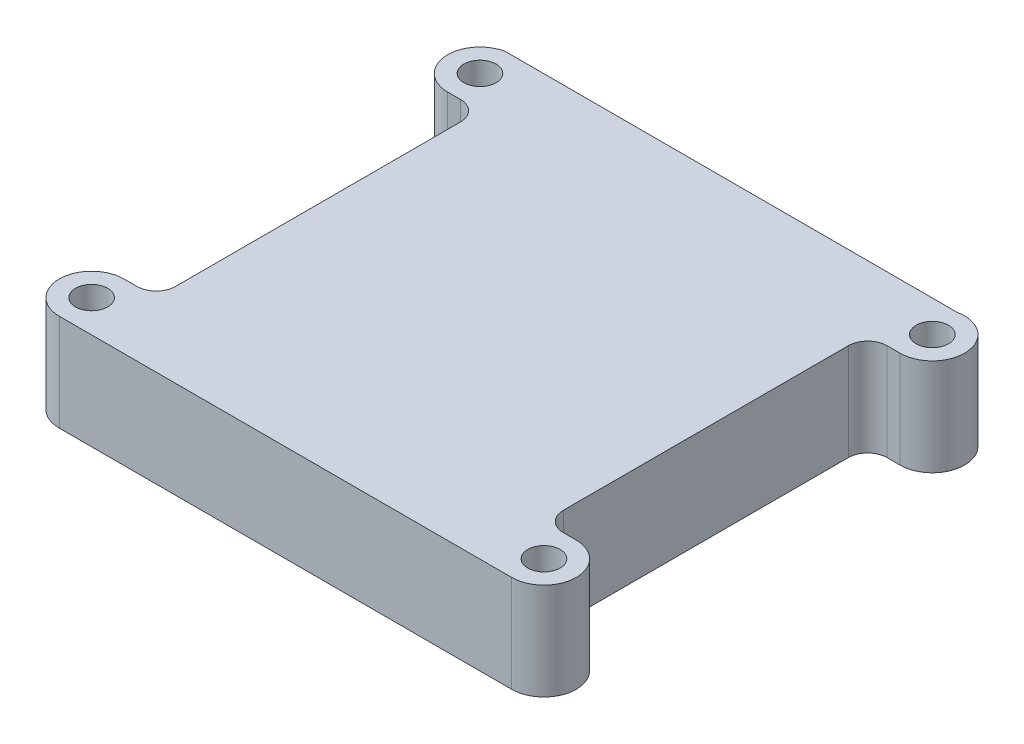
ISO-10303-21;
HEADER;
FILE_DESCRIPTION(('STEP AP214'),'2;1');
FILE_NAME('part.step','',(''),(''),'','','');
FILE_SCHEMA(('AUTOMOTIVE_DESIGN { 1 0 10303 214 1 1 1 1 }'));
ENDSEC;
DATA;
#1=APPLICATION_CONTEXT('core data for automotive mechanical design processes');
#2=APPLICATION_PROTOCOL_DEFINITION('international standard','automotive_design',2000,#1);
#3=PRODUCT_CONTEXT('',#1,'mechanical');
#4=PRODUCT('Part','Part','',(#3));
#5=PRODUCT_RELATED_PRODUCT_CATEGORY('part','',(#4));
#6=PRODUCT_DEFINITION_FORMATION('','',#4);
#7=PRODUCT_DEFINITION_CONTEXT('part definition',#1,'design');
#8=PRODUCT_DEFINITION('design','',#6,#7);
#9=PRODUCT_DEFINITION_SHAPE('','',#8);
#10=(LENGTH_UNIT() NAMED_UNIT(*) SI_UNIT(.MILLI.,.METRE.));
#11=(NAMED_UNIT(*) PLANE_ANGLE_UNIT() SI_UNIT($,.RADIAN.));
#12=(NAMED_UNIT(*) SI_UNIT($,.STERADIAN.) SOLID_ANGLE_UNIT());
#13=UNCERTAINTY_MEASURE_WITH_UNIT(LENGTH_MEASURE(1.E-05),#10,'distance_accuracy_value','');
#14=(GEOMETRIC_REPRESENTATION_CONTEXT(3) GLOBAL_UNCERTAINTY_ASSIGNED_CONTEXT((#13)) GLOBAL_UNIT_ASSIGNED_CONTEXT((#10,
#11,#12)) REPRESENTATION_CONTEXT('',''));
#15=CARTESIAN_POINT('',(0.,0.,0.));
#16=DIRECTION('',(0.,0.,1.));
#17=DIRECTION('',(1.,0.,0.));
#18=AXIS2_PLACEMENT_3D('',#15,#16,#17);
#19=CARTESIAN_POINT('',(35.,15.,-30.0989593233472));
#20=DIRECTION('',(0.,1.,0.));
#21=DIRECTION('',(0.,0.,1.));
#22=AXIS2_PLACEMENT_3D('',#19,#20,#21);
#23=PLANE('',#22);
#24=CARTESIAN_POINT('',(35.,15.,30.));
#25=DIRECTION('',(0.,1.,0.));
#26=DIRECTION('',(0.,0.,1.));
#27=AXIS2_PLACEMENT_3D('',#24,#25,#26);
#28=CIRCLE('',#27,2.5);
#29=CARTESIAN_POINT('',(35.,15.,32.5));
#30=VERTEX_POINT('',#29);
#31=EDGE_CURVE('E526',#30,#30,#28,.T.);
#32=ORIENTED_EDGE('',*,*,#31,.F.);
#33=EDGE_LOOP('',(#32));
#34=FACE_BOUND('',#33,.T.);
#35=CARTESIAN_POINT('',(-35.,15.,-30.0989593233472));
#36=DIRECTION('',(0.,1.,0.));
#37=DIRECTION('',(0.,0.,1.));
#38=AXIS2_PLACEMENT_3D('',#35,#36,#37);
#39=CIRCLE('',#38,2.5);
#40=CARTESIAN_POINT('',(-35.,15.,-27.5989593233472));
#41=VERTEX_POINT('',#40);
#42=EDGE_CURVE('E180',#41,#41,#39,.T.);
#43=ORIENTED_EDGE('',*,*,#42,.F.);
#44=EDGE_LOOP('',(#43));
#45=FACE_BOUND('',#44,.T.);
#46=DIRECTION('',(-1.,0.,0.));
#47=VECTOR('',#46,1.);
#48=CARTESIAN_POINT('',(30.,15.,-35.));
#49=LINE('',#48,#47);
#50=CARTESIAN_POINT('',(34.0101513823847,15.,-35.));
#51=VERTEX_POINT('',#50);
#52=CARTESIAN_POINT('',(-35.9898486176153,15.,-35.));
#53=VERTEX_POINT('',#52);
#54=EDGE_CURVE('E116',#51,#53,#49,.T.);
#55=ORIENTED_EDGE('',*,*,#54,.T.);
#56=CARTESIAN_POINT('',(-35.,15.,-30.0989593233472));
#57=DIRECTION('',(0.,1.,0.));
#58=DIRECTION('',(0.,0.,1.));
#59=AXIS2_PLACEMENT_3D('',#56,#57,#58);
#60=CIRCLE('',#59,5.);
#61=CARTESIAN_POINT('',(-35.,15.,-25.0989593233472));
#62=VERTEX_POINT('',#61);
#63=EDGE_CURVE('E298',#53,#62,#60,.T.);
#64=ORIENTED_EDGE('',*,*,#63,.T.);
#65=DIRECTION('',(1.,0.,0.));
#66=VECTOR('',#65,1.);
#67=CARTESIAN_POINT('',(-35.,15.,-25.0989593233472));
#68=LINE('',#67,#66);
#69=CARTESIAN_POINT('',(-33.,15.,-25.0989593233472));
#70=VERTEX_POINT('',#69);
#71=EDGE_CURVE('E249',#62,#70,#68,.T.);
#72=ORIENTED_EDGE('',*,*,#71,.T.);
#73=CARTESIAN_POINT('',(-33.,15.,-22.0989593233472));
#74=DIRECTION('',(0.,-1.,0.));
#75=DIRECTION('',(0.,0.,-1.));
#76=AXIS2_PLACEMENT_3D('',#73,#74,#75);
#77=CIRCLE('',#76,3.);
#78=CARTESIAN_POINT('',(-30.,15.,-22.0989593233472));
#79=VERTEX_POINT('',#78);
#80=EDGE_CURVE('E268',#70,#79,#77,.T.);
#81=ORIENTED_EDGE('',*,*,#80,.T.);
#82=DIRECTION('',(0.,0.,1.));
#83=VECTOR('',#82,1.);
#84=CARTESIAN_POINT('',(-30.,15.,22.));
#85=LINE('',#84,#83);
#86=CARTESIAN_POINT('',(-30.,15.,22.));
#87=VERTEX_POINT('',#86);
#88=EDGE_CURVE('E265',#79,#87,#85,.T.);
#89=ORIENTED_EDGE('',*,*,#88,.T.);
#90=CARTESIAN_POINT('',(-33.,15.,22.));
#91=DIRECTION('',(0.,-1.,0.));
#92=DIRECTION('',(0.,0.,1.));
#93=AXIS2_PLACEMENT_3D('',#90,#91,#92);
#94=CIRCLE('',#93,3.);
#95=CARTESIAN_POINT('',(-33.,15.,25.));
#96=VERTEX_POINT('',#95);
#97=EDGE_CURVE('E267',#87,#96,#94,.T.);
#98=ORIENTED_EDGE('',*,*,#97,.T.);
#99=DIRECTION('',(-1.,0.,0.));
#100=VECTOR('',#99,1.);
#101=CARTESIAN_POINT('',(-35.,15.,25.));
#102=LINE('',#101,#100);
#103=CARTESIAN_POINT('',(-35.,15.,25.));
#104=VERTEX_POINT('',#103);
#105=EDGE_CURVE('E270',#96,#104,#102,.T.);
#106=ORIENTED_EDGE('',*,*,#105,.T.);
#107=CARTESIAN_POINT('',(-35.,15.,30.));
#108=DIRECTION('',(0.,1.,0.));
#109=DIRECTION('',(0.,0.,1.));
#110=AXIS2_PLACEMENT_3D('',#107,#108,#109);
#111=CIRCLE('',#110,5.);
#112=CARTESIAN_POINT('',(-35.,15.,35.));
#113=VERTEX_POINT('',#112);
#114=EDGE_CURVE('E276',#104,#113,#111,.T.);
#115=ORIENTED_EDGE('',*,*,#114,.T.);
#116=DIRECTION('',(1.,0.,0.));
#117=VECTOR('',#116,1.);
#118=CARTESIAN_POINT('',(-35.,15.,35.));
#119=LINE('',#118,#117);
#120=CARTESIAN_POINT('',(35.,15.,35.));
#121=VERTEX_POINT('',#120);
#122=EDGE_CURVE('E278',#113,#121,#119,.T.);
#123=ORIENTED_EDGE('',*,*,#122,.T.);
#124=CARTESIAN_POINT('',(35.,15.,30.));
#125=DIRECTION('',(0.,1.,0.));
#126=DIRECTION('',(0.,0.,1.));
#127=AXIS2_PLACEMENT_3D('',#124,#125,#126);
#128=CIRCLE('',#127,5.);
#129=CARTESIAN_POINT('',(35.,15.,25.));
#130=VERTEX_POINT('',#129);
#131=EDGE_CURVE('E280',#121,#130,#128,.T.);
#132=ORIENTED_EDGE('',*,*,#131,.T.);
#133=DIRECTION('',(-1.,0.,0.));
#134=VECTOR('',#133,1.);
#135=CARTESIAN_POINT('',(33.,15.,25.));
#136=LINE('',#135,#134);
#137=CARTESIAN_POINT('',(33.,15.,25.));
#138=VERTEX_POINT('',#137);
#139=EDGE_CURVE('E282',#130,#138,#136,.T.);
#140=ORIENTED_EDGE('',*,*,#139,.T.);
#141=CARTESIAN_POINT('',(33.,15.,22.));
#142=DIRECTION('',(0.,-1.,0.));
#143=DIRECTION('',(0.,0.,-1.));
#144=AXIS2_PLACEMENT_3D('',#141,#142,#143);
#145=CIRCLE('',#144,3.);
#146=CARTESIAN_POINT('',(30.,15.,22.));
#147=VERTEX_POINT('',#146);
#148=EDGE_CURVE('E284',#138,#147,#145,.T.);
#149=ORIENTED_EDGE('',*,*,#148,.T.);
#150=DIRECTION('',(0.,0.,-1.));
#151=VECTOR('',#150,1.);
#152=CARTESIAN_POINT('',(30.,15.,22.));
#153=LINE('',#152,#151);
#154=CARTESIAN_POINT('',(30.,15.,-22.0989593233472));
#155=VERTEX_POINT('',#154);
#156=EDGE_CURVE('E160',#147,#155,#153,.T.);
#157=ORIENTED_EDGE('',*,*,#156,.T.);
#158=CARTESIAN_POINT('',(33.,15.,-22.0989593233472));
#159=DIRECTION('',(0.,-1.,0.));
#160=DIRECTION('',(0.,0.,1.));
#161=AXIS2_PLACEMENT_3D('',#158,#159,#160);
#162=CIRCLE('',#161,3.);
#163=CARTESIAN_POINT('',(33.,15.,-25.0989593233472));
#164=VERTEX_POINT('',#163);
#165=EDGE_CURVE('E154',#155,#164,#162,.T.);
#166=ORIENTED_EDGE('',*,*,#165,.T.);
#167=DIRECTION('',(1.,0.,0.));
#168=VECTOR('',#167,1.);
#169=CARTESIAN_POINT('',(33.,15.,-25.0989593233472));
#170=LINE('',#169,#168);
#171=CARTESIAN_POINT('',(35.,15.,-25.0989593233472));
#172=VERTEX_POINT('',#171);
#173=EDGE_CURVE('E158',#164,#172,#170,.T.);
#174=ORIENTED_EDGE('',*,*,#173,.T.);
#175=CARTESIAN_POINT('',(35.,15.,-30.0989593233472));
#176=DIRECTION('',(0.,1.,0.));
#177=DIRECTION('',(0.,0.,1.));
#178=AXIS2_PLACEMENT_3D('',#175,#176,#177);
#179=CIRCLE('',#178,5.);
#180=EDGE_CURVE('E50',#172,#51,#179,.T.);
#181=ORIENTED_EDGE('',*,*,#180,.T.);
#182=EDGE_LOOP('',(#55,#64,#72,#81,#89,#98,#106,#115,#123,#132,#140,#149,#157,#166,#174,#181));
#183=FACE_BOUND('',#182,.T.);
#184=CARTESIAN_POINT('',(35.,15.,-30.0989593233472));
#185=DIRECTION('',(0.,1.,0.));
#186=DIRECTION('',(0.,0.,1.));
#187=AXIS2_PLACEMENT_3D('',#184,#185,#186);
#188=CIRCLE('',#187,2.5);
#189=CARTESIAN_POINT('',(35.,15.,-27.5989593233472));
#190=VERTEX_POINT('',#189);
#191=EDGE_CURVE('E532',#190,#190,#188,.T.);
#192=ORIENTED_EDGE('',*,*,#191,.F.);
#193=EDGE_LOOP('',(#192));
#194=FACE_BOUND('',#193,.T.);
#195=CARTESIAN_POINT('',(-35.,15.,30.));
#196=DIRECTION('',(0.,1.,0.));
#197=DIRECTION('',(0.,0.,1.));
#198=AXIS2_PLACEMENT_3D('',#195,#196,#197);
#199=CIRCLE('',#198,2.5);
#200=CARTESIAN_POINT('',(-35.,15.,32.5));
#201=VERTEX_POINT('',#200);
#202=EDGE_CURVE('E517',#201,#201,#199,.T.);
#203=ORIENTED_EDGE('',*,*,#202,.F.);
#204=EDGE_LOOP('',(#203));
#205=FACE_BOUND('',#204,.T.);
#206=ADVANCED_FACE('F33',(#34,#45,#183,#194,#205),#23,.T.);
#207=CARTESIAN_POINT('',(35.,0.,-30.0989593233472));
#208=DIRECTION('',(0.,1.,0.));
#209=DIRECTION('',(0.,0.,1.));
#210=AXIS2_PLACEMENT_3D('',#207,#208,#209);
#211=PLANE('',#210);
#212=DIRECTION('',(-1.,0.,0.));
#213=VECTOR('',#212,1.);
#214=CARTESIAN_POINT('',(-35.9898486176153,0.,-35.));
#215=LINE('',#214,#213);
#216=CARTESIAN_POINT('',(34.0101513823847,0.,-35.));
#217=VERTEX_POINT('',#216);
#218=CARTESIAN_POINT('',(-35.9898486176153,0.,-35.));
#219=VERTEX_POINT('',#218);
#220=EDGE_CURVE('E110',#217,#219,#215,.T.);
#221=ORIENTED_EDGE('',*,*,#220,.F.);
#222=CARTESIAN_POINT('',(35.,0.,-30.0989593233472));
#223=DIRECTION('',(0.,1.,0.));
#224=DIRECTION('',(0.,0.,1.));
#225=AXIS2_PLACEMENT_3D('',#222,#223,#224);
#226=CIRCLE('',#225,5.);
#227=CARTESIAN_POINT('',(35.,0.,-25.0989593233472));
#228=VERTEX_POINT('',#227);
#229=EDGE_CURVE('E207',#228,#217,#226,.T.);
#230=ORIENTED_EDGE('',*,*,#229,.F.);
#231=DIRECTION('',(1.,0.,0.));
#232=VECTOR('',#231,1.);
#233=CARTESIAN_POINT('',(33.,0.,-25.0989593233472));
#234=LINE('',#233,#232);
#235=CARTESIAN_POINT('',(33.,0.,-25.0989593233472));
#236=VERTEX_POINT('',#235);
#237=EDGE_CURVE('E103',#236,#228,#234,.T.);
#238=ORIENTED_EDGE('',*,*,#237,.F.);
#239=CARTESIAN_POINT('',(33.,0.,-22.0989593233472));
#240=DIRECTION('',(0.,-1.,0.));
#241=DIRECTION('',(0.,0.,1.));
#242=AXIS2_PLACEMENT_3D('',#239,#240,#241);
#243=CIRCLE('',#242,3.);
#244=CARTESIAN_POINT('',(30.,0.,-22.0989593233472));
#245=VERTEX_POINT('',#244);
#246=EDGE_CURVE('E168',#245,#236,#243,.T.);
#247=ORIENTED_EDGE('',*,*,#246,.F.);
#248=DIRECTION('',(0.,0.,-1.));
#249=VECTOR('',#248,1.);
#250=CARTESIAN_POINT('',(30.,0.,22.));
#251=LINE('',#250,#249);
#252=CARTESIAN_POINT('',(30.,0.,22.));
#253=VERTEX_POINT('',#252);
#254=EDGE_CURVE('E203',#253,#245,#251,.T.);
#255=ORIENTED_EDGE('',*,*,#254,.F.);
#256=CARTESIAN_POINT('',(33.,0.,22.));
#257=DIRECTION('',(0.,-1.,0.));
#258=DIRECTION('',(0.,0.,-1.));
#259=AXIS2_PLACEMENT_3D('',#256,#257,#258);
#260=CIRCLE('',#259,3.);
#261=CARTESIAN_POINT('',(33.,0.,25.));
#262=VERTEX_POINT('',#261);
#263=EDGE_CURVE('E201',#262,#253,#260,.T.);
#264=ORIENTED_EDGE('',*,*,#263,.F.);
#265=DIRECTION('',(-1.,0.,0.));
#266=VECTOR('',#265,1.);
#267=CARTESIAN_POINT('',(33.,0.,25.));
#268=LINE('',#267,#266);
#269=CARTESIAN_POINT('',(35.,0.,25.));
#270=VERTEX_POINT('',#269);
#271=EDGE_CURVE('E199',#270,#262,#268,.T.);
#272=ORIENTED_EDGE('',*,*,#271,.F.);
#273=CARTESIAN_POINT('',(35.,0.,30.));
#274=DIRECTION('',(0.,1.,0.));
#275=DIRECTION('',(0.,0.,1.));
#276=AXIS2_PLACEMENT_3D('',#273,#274,#275);
#277=CIRCLE('',#276,5.);
#278=CARTESIAN_POINT('',(35.,0.,35.));
#279=VERTEX_POINT('',#278);
#280=EDGE_CURVE('E197',#279,#270,#277,.T.);
#281=ORIENTED_EDGE('',*,*,#280,.F.);
#282=DIRECTION('',(1.,0.,0.));
#283=VECTOR('',#282,1.);
#284=CARTESIAN_POINT('',(30.,0.,35.));
#285=LINE('',#284,#283);
#286=CARTESIAN_POINT('',(-35.,0.,35.));
#287=VERTEX_POINT('',#286);
#288=EDGE_CURVE('E195',#287,#279,#285,.T.);
#289=ORIENTED_EDGE('',*,*,#288,.F.);
#290=CARTESIAN_POINT('',(-35.,0.,30.));
#291=DIRECTION('',(0.,1.,0.));
#292=DIRECTION('',(0.,0.,1.));
#293=AXIS2_PLACEMENT_3D('',#290,#291,#292);
#294=CIRCLE('',#293,5.);
#295=CARTESIAN_POINT('',(-35.,0.,25.));
#296=VERTEX_POINT('',#295);
#297=EDGE_CURVE('E192',#296,#287,#294,.T.);
#298=ORIENTED_EDGE('',*,*,#297,.F.);
#299=DIRECTION('',(-1.,0.,0.));
#300=VECTOR('',#299,1.);
#301=CARTESIAN_POINT('',(-35.,0.,25.));
#302=LINE('',#301,#300);
#303=CARTESIAN_POINT('',(-33.,0.,25.));
#304=VERTEX_POINT('',#303);
#305=EDGE_CURVE('E190',#304,#296,#302,.T.);
#306=ORIENTED_EDGE('',*,*,#305,.F.);
#307=CARTESIAN_POINT('',(-33.,0.,22.));
#308=DIRECTION('',(0.,-1.,0.));
#309=DIRECTION('',(0.,0.,1.));
#310=AXIS2_PLACEMENT_3D('',#307,#308,#309);
#311=CIRCLE('',#310,3.);
#312=CARTESIAN_POINT('',(-30.,0.,22.));
#313=VERTEX_POINT('',#312);
#314=EDGE_CURVE('E188',#313,#304,#311,.T.);
#315=ORIENTED_EDGE('',*,*,#314,.F.);
#316=DIRECTION('',(0.,0.,1.));
#317=VECTOR('',#316,1.);
#318=CARTESIAN_POINT('',(-30.,0.,22.));
#319=LINE('',#318,#317);
#320=CARTESIAN_POINT('',(-30.,0.,-22.0989593233472));
#321=VERTEX_POINT('',#320);
#322=EDGE_CURVE('E186',#321,#313,#319,.T.);
#323=ORIENTED_EDGE('',*,*,#322,.F.);
#324=CARTESIAN_POINT('',(-33.,0.,-22.0989593233472));
#325=DIRECTION('',(0.,-1.,0.));
#326=DIRECTION('',(0.,0.,-1.));
#327=AXIS2_PLACEMENT_3D('',#324,#325,#326);
#328=CIRCLE('',#327,3.);
#329=CARTESIAN_POINT('',(-33.,0.,-25.0989593233472));
#330=VERTEX_POINT('',#329);
#331=EDGE_CURVE('E184',#330,#321,#328,.T.);
#332=ORIENTED_EDGE('',*,*,#331,.F.);
#333=DIRECTION('',(1.,0.,0.));
#334=VECTOR('',#333,1.);
#335=CARTESIAN_POINT('',(-35.,0.,-25.0989593233472));
#336=LINE('',#335,#334);
#337=CARTESIAN_POINT('',(-35.,0.,-25.0989593233472));
#338=VERTEX_POINT('',#337);
#339=EDGE_CURVE('E182',#338,#330,#336,.T.);
#340=ORIENTED_EDGE('',*,*,#339,.F.);
#341=CARTESIAN_POINT('',(-35.,0.,-30.0989593233472));
#342=DIRECTION('',(0.,1.,0.));
#343=DIRECTION('',(0.,0.,1.));
#344=AXIS2_PLACEMENT_3D('',#341,#342,#343);
#345=CIRCLE('',#344,5.);
#346=EDGE_CURVE('E179',#219,#338,#345,.T.);
#347=ORIENTED_EDGE('',*,*,#346,.F.);
#348=EDGE_LOOP('',(#221,#230,#238,#247,#255,#264,#272,#281,#289,#298,#306,#315,#323,#332,#340,#347));
#349=FACE_BOUND('',#348,.T.);
#350=CARTESIAN_POINT('',(-35.,0.,-30.0989593233472));
#351=DIRECTION('',(0.,1.,0.));
#352=DIRECTION('',(0.,0.,1.));
#353=AXIS2_PLACEMENT_3D('',#350,#351,#352);
#354=CIRCLE('',#353,2.5);
#355=CARTESIAN_POINT('',(-35.,0.,-27.5989593233472));
#356=VERTEX_POINT('',#355);
#357=EDGE_CURVE('E302',#356,#356,#354,.T.);
#358=ORIENTED_EDGE('',*,*,#357,.T.);
#359=EDGE_LOOP('',(#358));
#360=FACE_BOUND('',#359,.T.);
#361=CARTESIAN_POINT('',(35.,0.,-30.0989593233472));
#362=DIRECTION('',(0.,1.,0.));
#363=DIRECTION('',(0.,0.,1.));
#364=AXIS2_PLACEMENT_3D('',#361,#362,#363);
#365=CIRCLE('',#364,2.5);
#366=CARTESIAN_POINT('',(35.,0.,-27.5989593233472));
#367=VERTEX_POINT('',#366);
#368=EDGE_CURVE('E529',#367,#367,#365,.T.);
#369=ORIENTED_EDGE('',*,*,#368,.T.);
#370=EDGE_LOOP('',(#369));
#371=FACE_BOUND('',#370,.T.);
#372=CARTESIAN_POINT('',(35.,0.,30.));
#373=DIRECTION('',(0.,1.,0.));
#374=DIRECTION('',(0.,0.,1.));
#375=AXIS2_PLACEMENT_3D('',#372,#373,#374);
#376=CIRCLE('',#375,2.5);
#377=CARTESIAN_POINT('',(35.,0.,32.5));
#378=VERTEX_POINT('',#377);
#379=EDGE_CURVE('E523',#378,#378,#376,.T.);
#380=ORIENTED_EDGE('',*,*,#379,.T.);
#381=EDGE_LOOP('',(#380));
#382=FACE_BOUND('',#381,.T.);
#383=CARTESIAN_POINT('',(-35.,0.,30.));
#384=DIRECTION('',(0.,1.,0.));
#385=DIRECTION('',(0.,0.,1.));
#386=AXIS2_PLACEMENT_3D('',#383,#384,#385);
#387=CIRCLE('',#386,2.5);
#388=CARTESIAN_POINT('',(-35.,0.,32.5));
#389=VERTEX_POINT('',#388);
#390=EDGE_CURVE('E520',#389,#389,#387,.T.);
#391=ORIENTED_EDGE('',*,*,#390,.T.);
#392=EDGE_LOOP('',(#391));
#393=FACE_BOUND('',#392,.T.);
#394=ADVANCED_FACE('F253',(#349,#360,#371,#382,#393),#211,.F.);
#395=CARTESIAN_POINT('',(-35.9898486176153,15.,-35.));
#396=DIRECTION('',(0.,0.,1.));
#397=DIRECTION('',(1.,0.,0.));
#398=AXIS2_PLACEMENT_3D('',#395,#396,#397);
#399=PLANE('',#398);
#400=ORIENTED_EDGE('',*,*,#220,.T.);
#401=DIRECTION('',(0.,-1.,0.));
#402=VECTOR('',#401,1.);
#403=CARTESIAN_POINT('',(-35.9898486176153,15.,-35.));
#404=LINE('',#403,#402);
#405=EDGE_CURVE('E11',#53,#219,#404,.T.);
#406=ORIENTED_EDGE('',*,*,#405,.F.);
#407=ORIENTED_EDGE('',*,*,#54,.F.);
#408=DIRECTION('',(0.,-1.,0.));
#409=VECTOR('',#408,1.);
#410=CARTESIAN_POINT('',(34.0101513823847,15.,-35.));
#411=LINE('',#410,#409);
#412=EDGE_CURVE('E174',#51,#217,#411,.T.);
#413=ORIENTED_EDGE('',*,*,#412,.T.);
#414=EDGE_LOOP('',(#400,#406,#407,#413));
#415=FACE_BOUND('',#414,.T.);
#416=ADVANCED_FACE('F35',(#415),#399,.F.);
#417=CARTESIAN_POINT('',(-35.,15.,-30.0989593233472));
#418=DIRECTION('',(0.,-1.,0.));
#419=DIRECTION('',(0.,0.,-1.));
#420=AXIS2_PLACEMENT_3D('',#417,#418,#419);
#421=CYLINDRICAL_SURFACE('',#420,5.);
#422=ORIENTED_EDGE('',*,*,#346,.T.);
#423=DIRECTION('',(0.,-1.,0.));
#424=VECTOR('',#423,1.);
#425=CARTESIAN_POINT('',(-35.,15.,-25.0989593233472));
#426=LINE('',#425,#424);
#427=EDGE_CURVE('E42',#62,#338,#426,.T.);
#428=ORIENTED_EDGE('',*,*,#427,.F.);
#429=ORIENTED_EDGE('',*,*,#63,.F.);
#430=ORIENTED_EDGE('',*,*,#405,.T.);
#431=EDGE_LOOP('',(#422,#428,#429,#430));
#432=FACE_BOUND('',#431,.T.);
#433=ADVANCED_FACE('F304',(#432),#421,.T.);
#434=CARTESIAN_POINT('',(-35.,15.,-25.0989593233472));
#435=DIRECTION('',(0.,0.,-1.));
#436=DIRECTION('',(-1.,0.,0.));
#437=AXIS2_PLACEMENT_3D('',#434,#435,#436);
#438=PLANE('',#437);
#439=ORIENTED_EDGE('',*,*,#339,.T.);
#440=DIRECTION('',(0.,-1.,0.));
#441=VECTOR('',#440,1.);
#442=CARTESIAN_POINT('',(-33.,15.,-25.0989593233472));
#443=LINE('',#442,#441);
#444=EDGE_CURVE('E240',#70,#330,#443,.T.);
#445=ORIENTED_EDGE('',*,*,#444,.F.);
#446=ORIENTED_EDGE('',*,*,#71,.F.);
#447=ORIENTED_EDGE('',*,*,#427,.T.);
#448=EDGE_LOOP('',(#439,#445,#446,#447));
#449=FACE_BOUND('',#448,.T.);
#450=ADVANCED_FACE('F247',(#449),#438,.F.);
#451=CARTESIAN_POINT('',(-33.,15.,-22.0989593233472));
#452=DIRECTION('',(0.,-1.,0.));
#453=DIRECTION('',(0.,0.,-1.));
#454=AXIS2_PLACEMENT_3D('',#451,#452,#453);
#455=CYLINDRICAL_SURFACE('',#454,3.);
#456=ORIENTED_EDGE('',*,*,#331,.T.);
#457=DIRECTION('',(0.,-1.,0.));
#458=VECTOR('',#457,1.);
#459=CARTESIAN_POINT('',(-30.,15.,-22.0989593233472));
#460=LINE('',#459,#458);
#461=EDGE_CURVE('E237',#79,#321,#460,.T.);
#462=ORIENTED_EDGE('',*,*,#461,.F.);
#463=ORIENTED_EDGE('',*,*,#80,.F.);
#464=ORIENTED_EDGE('',*,*,#444,.T.);
#465=EDGE_LOOP('',(#456,#462,#463,#464));
#466=FACE_BOUND('',#465,.T.);
#467=ADVANCED_FACE('F259',(#466),#455,.F.);
#468=CARTESIAN_POINT('',(-30.,15.,22.));
#469=DIRECTION('',(1.,0.,0.));
#470=DIRECTION('',(0.,0.,-1.));
#471=AXIS2_PLACEMENT_3D('',#468,#469,#470);
#472=PLANE('',#471);
#473=ORIENTED_EDGE('',*,*,#322,.T.);
#474=DIRECTION('',(0.,-1.,0.));
#475=VECTOR('',#474,1.);
#476=CARTESIAN_POINT('',(-30.,15.,22.));
#477=LINE('',#476,#475);
#478=EDGE_CURVE('E234',#87,#313,#477,.T.);
#479=ORIENTED_EDGE('',*,*,#478,.F.);
#480=ORIENTED_EDGE('',*,*,#88,.F.);
#481=ORIENTED_EDGE('',*,*,#461,.T.);
#482=EDGE_LOOP('',(#473,#479,#480,#481));
#483=FACE_BOUND('',#482,.T.);
#484=ADVANCED_FACE('F263',(#483),#472,.F.);
#485=CARTESIAN_POINT('',(-33.,15.,22.));
#486=DIRECTION('',(0.,-1.,0.));
#487=DIRECTION('',(0.,0.,-1.));
#488=AXIS2_PLACEMENT_3D('',#485,#486,#487);
#489=CYLINDRICAL_SURFACE('',#488,3.);
#490=ORIENTED_EDGE('',*,*,#314,.T.);
#491=DIRECTION('',(0.,-1.,0.));
#492=VECTOR('',#491,1.);
#493=CARTESIAN_POINT('',(-33.,15.,25.));
#494=LINE('',#493,#492);
#495=EDGE_CURVE('E231',#96,#304,#494,.T.);
#496=ORIENTED_EDGE('',*,*,#495,.F.);
#497=ORIENTED_EDGE('',*,*,#97,.F.);
#498=ORIENTED_EDGE('',*,*,#478,.T.);
#499=EDGE_LOOP('',(#490,#496,#497,#498));
#500=FACE_BOUND('',#499,.T.);
#501=ADVANCED_FACE('F353',(#500),#489,.F.);
#502=CARTESIAN_POINT('',(-35.,15.,25.));
#503=DIRECTION('',(0.,0.,1.));
#504=DIRECTION('',(1.,0.,0.));
#505=AXIS2_PLACEMENT_3D('',#502,#503,#504);
#506=PLANE('',#505);
#507=ORIENTED_EDGE('',*,*,#305,.T.);
#508=DIRECTION('',(0.,-1.,0.));
#509=VECTOR('',#508,1.);
#510=CARTESIAN_POINT('',(-35.,15.,25.));
#511=LINE('',#510,#509);
#512=EDGE_CURVE('E228',#104,#296,#511,.T.);
#513=ORIENTED_EDGE('',*,*,#512,.F.);
#514=ORIENTED_EDGE('',*,*,#105,.F.);
#515=ORIENTED_EDGE('',*,*,#495,.T.);
#516=EDGE_LOOP('',(#507,#513,#514,#515));
#517=FACE_BOUND('',#516,.T.);
#518=ADVANCED_FACE('F349',(#517),#506,.F.);
#519=CARTESIAN_POINT('',(-35.,15.,30.));
#520=DIRECTION('',(0.,-1.,0.));
#521=DIRECTION('',(0.,0.,-1.));
#522=AXIS2_PLACEMENT_3D('',#519,#520,#521);
#523=CYLINDRICAL_SURFACE('',#522,5.);
#524=ORIENTED_EDGE('',*,*,#297,.T.);
#525=DIRECTION('',(0.,-1.,0.));
#526=VECTOR('',#525,1.);
#527=CARTESIAN_POINT('',(-35.,15.,35.));
#528=LINE('',#527,#526);
#529=EDGE_CURVE('E225',#113,#287,#528,.T.);
#530=ORIENTED_EDGE('',*,*,#529,.F.);
#531=ORIENTED_EDGE('',*,*,#114,.F.);
#532=ORIENTED_EDGE('',*,*,#512,.T.);
#533=EDGE_LOOP('',(#524,#530,#531,#532));
#534=FACE_BOUND('',#533,.T.);
#535=ADVANCED_FACE('F345',(#534),#523,.T.);
#536=CARTESIAN_POINT('',(30.,15.,35.));
#537=DIRECTION('',(0.,0.,-1.));
#538=DIRECTION('',(-1.,0.,0.));
#539=AXIS2_PLACEMENT_3D('',#536,#537,#538);
#540=PLANE('',#539);
#541=ORIENTED_EDGE('',*,*,#288,.T.);
#542=DIRECTION('',(0.,-1.,0.));
#543=VECTOR('',#542,1.);
#544=CARTESIAN_POINT('',(35.,15.,35.));
#545=LINE('',#544,#543);
#546=EDGE_CURVE('E222',#121,#279,#545,.T.);
#547=ORIENTED_EDGE('',*,*,#546,.F.);
#548=ORIENTED_EDGE('',*,*,#122,.F.);
#549=ORIENTED_EDGE('',*,*,#529,.T.);
#550=EDGE_LOOP('',(#541,#547,#548,#549));
#551=FACE_BOUND('',#550,.T.);
#552=ADVANCED_FACE('F341',(#551),#540,.F.);
#553=CARTESIAN_POINT('',(35.,15.,30.));
#554=DIRECTION('',(0.,-1.,0.));
#555=DIRECTION('',(0.,0.,-1.));
#556=AXIS2_PLACEMENT_3D('',#553,#554,#555);
#557=CYLINDRICAL_SURFACE('',#556,5.);
#558=ORIENTED_EDGE('',*,*,#280,.T.);
#559=DIRECTION('',(0.,-1.,0.));
#560=VECTOR('',#559,1.);
#561=CARTESIAN_POINT('',(35.,15.,25.));
#562=LINE('',#561,#560);
#563=EDGE_CURVE('E219',#130,#270,#562,.T.);
#564=ORIENTED_EDGE('',*,*,#563,.F.);
#565=ORIENTED_EDGE('',*,*,#131,.F.);
#566=ORIENTED_EDGE('',*,*,#546,.T.);
#567=EDGE_LOOP('',(#558,#564,#565,#566));
#568=FACE_BOUND('',#567,.T.);
#569=ADVANCED_FACE('F337',(#568),#557,.T.);
#570=CARTESIAN_POINT('',(33.,15.,25.));
#571=DIRECTION('',(0.,0.,1.));
#572=DIRECTION('',(1.,0.,0.));
#573=AXIS2_PLACEMENT_3D('',#570,#571,#572);
#574=PLANE('',#573);
#575=ORIENTED_EDGE('',*,*,#271,.T.);
#576=DIRECTION('',(0.,-1.,0.));
#577=VECTOR('',#576,1.);
#578=CARTESIAN_POINT('',(33.,15.,25.));
#579=LINE('',#578,#577);
#580=EDGE_CURVE('E216',#138,#262,#579,.T.);
#581=ORIENTED_EDGE('',*,*,#580,.F.);
#582=ORIENTED_EDGE('',*,*,#139,.F.);
#583=ORIENTED_EDGE('',*,*,#563,.T.);
#584=EDGE_LOOP('',(#575,#581,#582,#583));
#585=FACE_BOUND('',#584,.T.);
#586=ADVANCED_FACE('F334',(#585),#574,.F.);
#587=CARTESIAN_POINT('',(33.,15.,22.));
#588=DIRECTION('',(0.,-1.,0.));
#589=DIRECTION('',(0.,0.,-1.));
#590=AXIS2_PLACEMENT_3D('',#587,#588,#589);
#591=CYLINDRICAL_SURFACE('',#590,3.);
#592=ORIENTED_EDGE('',*,*,#263,.T.);
#593=DIRECTION('',(0.,-1.,0.));
#594=VECTOR('',#593,1.);
#595=CARTESIAN_POINT('',(30.,15.,22.));
#596=LINE('',#595,#594);
#597=EDGE_CURVE('E213',#147,#253,#596,.T.);
#598=ORIENTED_EDGE('',*,*,#597,.F.);
#599=ORIENTED_EDGE('',*,*,#148,.F.);
#600=ORIENTED_EDGE('',*,*,#580,.T.);
#601=EDGE_LOOP('',(#592,#598,#599,#600));
#602=FACE_BOUND('',#601,.T.);
#603=ADVANCED_FACE('F290',(#602),#591,.F.);
#604=CARTESIAN_POINT('',(30.,15.,22.));
#605=DIRECTION('',(-1.,0.,0.));
#606=DIRECTION('',(0.,0.,1.));
#607=AXIS2_PLACEMENT_3D('',#604,#605,#606);
#608=PLANE('',#607);
#609=ORIENTED_EDGE('',*,*,#254,.T.);
#610=DIRECTION('',(0.,-1.,0.));
#611=VECTOR('',#610,1.);
#612=CARTESIAN_POINT('',(30.,15.,-22.0989593233472));
#613=LINE('',#612,#611);
#614=EDGE_CURVE('E169',#155,#245,#613,.T.);
#615=ORIENTED_EDGE('',*,*,#614,.F.);
#616=ORIENTED_EDGE('',*,*,#156,.F.);
#617=ORIENTED_EDGE('',*,*,#597,.T.);
#618=EDGE_LOOP('',(#609,#615,#616,#617));
#619=FACE_BOUND('',#618,.T.);
#620=ADVANCED_FACE('F294',(#619),#608,.F.);
#621=CARTESIAN_POINT('',(33.,15.,-22.0989593233472));
#622=DIRECTION('',(0.,-1.,0.));
#623=DIRECTION('',(0.,0.,-1.));
#624=AXIS2_PLACEMENT_3D('',#621,#622,#623);
#625=CYLINDRICAL_SURFACE('',#624,3.);
#626=ORIENTED_EDGE('',*,*,#246,.T.);
#627=DIRECTION('',(0.,-1.,0.));
#628=VECTOR('',#627,1.);
#629=CARTESIAN_POINT('',(33.,15.,-25.0989593233472));
#630=LINE('',#629,#628);
#631=EDGE_CURVE('E165',#164,#236,#630,.T.);
#632=ORIENTED_EDGE('',*,*,#631,.F.);
#633=ORIENTED_EDGE('',*,*,#165,.F.);
#634=ORIENTED_EDGE('',*,*,#614,.T.);
#635=EDGE_LOOP('',(#626,#632,#633,#634));
#636=FACE_BOUND('',#635,.T.);
#637=ADVANCED_FACE('F166',(#636),#625,.F.);
#638=CARTESIAN_POINT('',(33.,15.,-25.0989593233472));
#639=DIRECTION('',(0.,0.,-1.));
#640=DIRECTION('',(-1.,0.,0.));
#641=AXIS2_PLACEMENT_3D('',#638,#639,#640);
#642=PLANE('',#641);
#643=ORIENTED_EDGE('',*,*,#237,.T.);
#644=DIRECTION('',(0.,-1.,0.));
#645=VECTOR('',#644,1.);
#646=CARTESIAN_POINT('',(35.,15.,-25.0989593233472));
#647=LINE('',#646,#645);
#648=EDGE_CURVE('E170',#172,#228,#647,.T.);
#649=ORIENTED_EDGE('',*,*,#648,.F.);
#650=ORIENTED_EDGE('',*,*,#173,.F.);
#651=ORIENTED_EDGE('',*,*,#631,.T.);
#652=EDGE_LOOP('',(#643,#649,#650,#651));
#653=FACE_BOUND('',#652,.T.);
#654=ADVANCED_FACE('F172',(#653),#642,.F.);
#655=CARTESIAN_POINT('',(35.,15.,-30.0989593233472));
#656=DIRECTION('',(0.,-1.,0.));
#657=DIRECTION('',(0.,0.,-1.));
#658=AXIS2_PLACEMENT_3D('',#655,#656,#657);
#659=CYLINDRICAL_SURFACE('',#658,5.);
#660=ORIENTED_EDGE('',*,*,#229,.T.);
#661=ORIENTED_EDGE('',*,*,#412,.F.);
#662=ORIENTED_EDGE('',*,*,#180,.F.);
#663=ORIENTED_EDGE('',*,*,#648,.T.);
#664=EDGE_LOOP('',(#660,#661,#662,#663));
#665=FACE_BOUND('',#664,.T.);
#666=ADVANCED_FACE('F296',(#665),#659,.T.);
#667=CARTESIAN_POINT('',(-35.,15.,-30.0989593233472));
#668=DIRECTION('',(0.,-1.,0.));
#669=DIRECTION('',(0.,0.,-1.));
#670=AXIS2_PLACEMENT_3D('',#667,#668,#669);
#671=CYLINDRICAL_SURFACE('',#670,2.5);
#672=ORIENTED_EDGE('',*,*,#42,.T.);
#673=EDGE_LOOP('',(#672));
#674=FACE_BOUND('',#673,.T.);
#675=ORIENTED_EDGE('',*,*,#357,.F.);
#676=EDGE_LOOP('',(#675));
#677=FACE_BOUND('',#676,.T.);
#678=ADVANCED_FACE('F321',(#674,#677),#671,.F.);
#679=CARTESIAN_POINT('',(35.,15.,-30.0989593233472));
#680=DIRECTION('',(0.,-1.,0.));
#681=DIRECTION('',(0.,0.,-1.));
#682=AXIS2_PLACEMENT_3D('',#679,#680,#681);
#683=CYLINDRICAL_SURFACE('',#682,2.5);
#684=ORIENTED_EDGE('',*,*,#191,.T.);
#685=EDGE_LOOP('',(#684));
#686=FACE_BOUND('',#685,.T.);
#687=ORIENTED_EDGE('',*,*,#368,.F.);
#688=EDGE_LOOP('',(#687));
#689=FACE_BOUND('',#688,.T.);
#690=ADVANCED_FACE('F419',(#686,#689),#683,.F.);
#691=CARTESIAN_POINT('',(35.,15.,30.));
#692=DIRECTION('',(0.,-1.,0.));
#693=DIRECTION('',(0.,0.,-1.));
#694=AXIS2_PLACEMENT_3D('',#691,#692,#693);
#695=CYLINDRICAL_SURFACE('',#694,2.5);
#696=ORIENTED_EDGE('',*,*,#31,.T.);
#697=EDGE_LOOP('',(#696));
#698=FACE_BOUND('',#697,.T.);
#699=ORIENTED_EDGE('',*,*,#379,.F.);
#700=EDGE_LOOP('',(#699));
#701=FACE_BOUND('',#700,.T.);
#702=ADVANCED_FACE('F426',(#698,#701),#695,.F.);
#703=CARTESIAN_POINT('',(-35.,15.,30.));
#704=DIRECTION('',(0.,-1.,0.));
#705=DIRECTION('',(0.,0.,-1.));
#706=AXIS2_PLACEMENT_3D('',#703,#704,#705);
#707=CYLINDRICAL_SURFACE('',#706,2.5);
#708=ORIENTED_EDGE('',*,*,#202,.T.);
#709=EDGE_LOOP('',(#708));
#710=FACE_BOUND('',#709,.T.);
#711=ORIENTED_EDGE('',*,*,#390,.F.);
#712=EDGE_LOOP('',(#711));
#713=FACE_BOUND('',#712,.T.);
#714=ADVANCED_FACE('F433',(#710,#713),#707,.F.);
#715=CLOSED_SHELL('',(#206,#394,#416,#433,#450,#467,#484,#501,#518,#535,#552,#569,#586,#603,
#620,#637,#654,#666,#678,#690,#702,#714));
#716=MANIFOLD_SOLID_BREP('B2',#715);
#717=ADVANCED_BREP_SHAPE_REPRESENTATION('',(#18,#716),#14);
#718=SHAPE_DEFINITION_REPRESENTATION(#9,#717);
ENDSEC;
END-ISO-10303-21;
